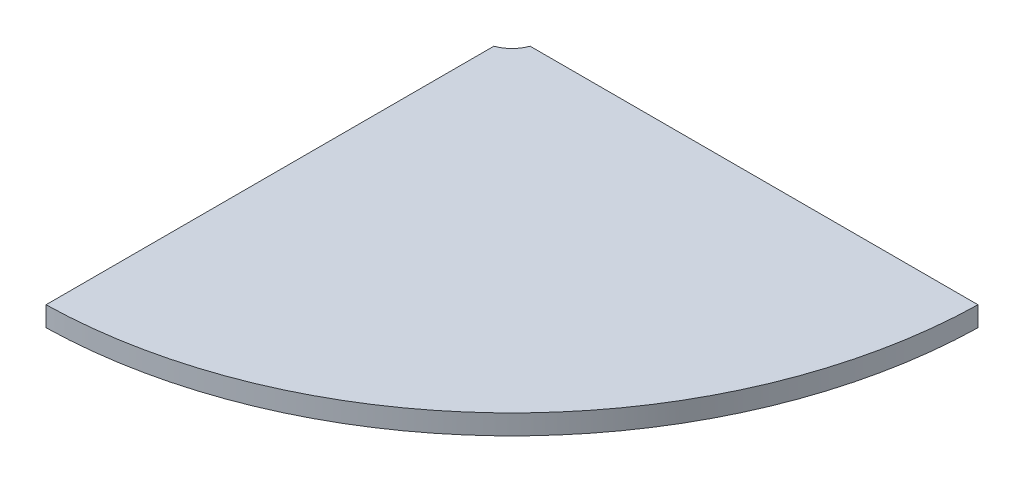
ISO-10303-21;
HEADER;
FILE_DESCRIPTION(('STEP AP214'),'2;1');
FILE_NAME('part.step','',(''),(''),'','','');
FILE_SCHEMA(('AUTOMOTIVE_DESIGN { 1 0 10303 214 1 1 1 1 }'));
ENDSEC;
DATA;
#1=APPLICATION_CONTEXT('core data for automotive mechanical design processes');
#2=APPLICATION_PROTOCOL_DEFINITION('international standard','automotive_design',2000,#1);
#3=PRODUCT_CONTEXT('',#1,'mechanical');
#4=PRODUCT('Part','Part','',(#3));
#5=PRODUCT_RELATED_PRODUCT_CATEGORY('part','',(#4));
#6=PRODUCT_DEFINITION_FORMATION('','',#4);
#7=PRODUCT_DEFINITION_CONTEXT('part definition',#1,'design');
#8=PRODUCT_DEFINITION('design','',#6,#7);
#9=PRODUCT_DEFINITION_SHAPE('','',#8);
#10=(LENGTH_UNIT() NAMED_UNIT(*) SI_UNIT(.MILLI.,.METRE.));
#11=(NAMED_UNIT(*) PLANE_ANGLE_UNIT() SI_UNIT($,.RADIAN.));
#12=(NAMED_UNIT(*) SI_UNIT($,.STERADIAN.) SOLID_ANGLE_UNIT());
#13=UNCERTAINTY_MEASURE_WITH_UNIT(LENGTH_MEASURE(1.E-05),#10,'distance_accuracy_value','');
#14=(GEOMETRIC_REPRESENTATION_CONTEXT(3) GLOBAL_UNCERTAINTY_ASSIGNED_CONTEXT((#13)) GLOBAL_UNIT_ASSIGNED_CONTEXT((#10,
#11,#12)) REPRESENTATION_CONTEXT('',''));
#15=CARTESIAN_POINT('',(0.,0.,0.));
#16=DIRECTION('',(0.,0.,1.));
#17=DIRECTION('',(1.,0.,0.));
#18=AXIS2_PLACEMENT_3D('',#15,#16,#17);
#19=CARTESIAN_POINT('',(-0.0717741825261257,10.,-0.104655935948575));
#20=DIRECTION('',(0.,-1.,0.));
#21=DIRECTION('',(0.,0.,-1.));
#22=AXIS2_PLACEMENT_3D('',#19,#20,#21);
#23=CYLINDRICAL_SURFACE('',#22,239.031706039067);
#24=CARTESIAN_POINT('',(-0.0717741825261257,0.,-0.104655935948575));
#25=DIRECTION('',(0.,1.,0.));
#26=DIRECTION('',(0.,0.,1.));
#27=AXIS2_PLACEMENT_3D('',#24,#25,#26);
#28=CIRCLE('',#27,239.031706039067);
#29=CARTESIAN_POINT('',(4.90805302662105,0.,238.875171273199));
#30=VERTEX_POINT('',#29);
#31=CARTESIAN_POINT('',(238.908053026621,0.,4.87517127319865));
#32=VERTEX_POINT('',#31);
#33=EDGE_CURVE('E113',#30,#32,#28,.T.);
#34=ORIENTED_EDGE('',*,*,#33,.T.);
#35=DIRECTION('',(0.,-1.,0.));
#36=VECTOR('',#35,1.);
#37=CARTESIAN_POINT('',(238.908053026621,10.,4.87517127319865));
#38=LINE('',#37,#36);
#39=CARTESIAN_POINT('',(238.908053026621,10.,4.87517127319865));
#40=VERTEX_POINT('',#39);
#41=EDGE_CURVE('E11',#40,#32,#38,.T.);
#42=ORIENTED_EDGE('',*,*,#41,.F.);
#43=CARTESIAN_POINT('',(-0.0717741825261257,10.,-0.104655935948575));
#44=DIRECTION('',(0.,1.,0.));
#45=DIRECTION('',(0.,0.,1.));
#46=AXIS2_PLACEMENT_3D('',#43,#44,#45);
#47=CIRCLE('',#46,239.031706039067);
#48=CARTESIAN_POINT('',(4.90805302662105,10.,238.875171273199));
#49=VERTEX_POINT('',#48);
#50=EDGE_CURVE('E97',#49,#40,#47,.T.);
#51=ORIENTED_EDGE('',*,*,#50,.F.);
#52=DIRECTION('',(0.,-1.,0.));
#53=VECTOR('',#52,1.);
#54=CARTESIAN_POINT('',(4.90805302662105,10.,238.875171273199));
#55=LINE('',#54,#53);
#56=EDGE_CURVE('E109',#49,#30,#55,.T.);
#57=ORIENTED_EDGE('',*,*,#56,.T.);
#58=EDGE_LOOP('',(#34,#42,#51,#57));
#59=FACE_BOUND('',#58,.T.);
#60=ADVANCED_FACE('F45',(#59),#23,.T.);
#61=CARTESIAN_POINT('',(238.908053026621,10.,4.87517127319865));
#62=DIRECTION('',(0.,0.,1.));
#63=DIRECTION('',(1.,0.,0.));
#64=AXIS2_PLACEMENT_3D('',#61,#62,#63);
#65=PLANE('',#64);
#66=DIRECTION('',(-1.,0.,0.));
#67=VECTOR('',#66,1.);
#68=CARTESIAN_POINT('',(238.908053026621,0.,4.87517127319865));
#69=LINE('',#68,#67);
#70=CARTESIAN_POINT('',(14.013304172375,0.,4.87517127319865));
#71=VERTEX_POINT('',#70);
#72=EDGE_CURVE('E102',#32,#71,#69,.T.);
#73=ORIENTED_EDGE('',*,*,#72,.T.);
#74=DIRECTION('',(0.,-1.,0.));
#75=VECTOR('',#74,1.);
#76=CARTESIAN_POINT('',(14.013304172375,10.,4.87517127319865));
#77=LINE('',#76,#75);
#78=CARTESIAN_POINT('',(14.013304172375,10.,4.87517127319865));
#79=VERTEX_POINT('',#78);
#80=EDGE_CURVE('E54',#79,#71,#77,.T.);
#81=ORIENTED_EDGE('',*,*,#80,.F.);
#82=DIRECTION('',(-1.,0.,0.));
#83=VECTOR('',#82,1.);
#84=CARTESIAN_POINT('',(238.908053026621,10.,4.87517127319865));
#85=LINE('',#84,#83);
#86=EDGE_CURVE('E92',#40,#79,#85,.T.);
#87=ORIENTED_EDGE('',*,*,#86,.F.);
#88=ORIENTED_EDGE('',*,*,#41,.T.);
#89=EDGE_LOOP('',(#73,#81,#87,#88));
#90=FACE_BOUND('',#89,.T.);
#91=ADVANCED_FACE('F101',(#90),#65,.F.);
#92=CARTESIAN_POINT('',(-0.0717741825261257,10.,-0.104655935948576));
#93=DIRECTION('',(0.,-1.,0.));
#94=DIRECTION('',(0.,0.,-1.));
#95=AXIS2_PLACEMENT_3D('',#92,#93,#94);
#96=CYLINDRICAL_SURFACE('',#95,14.9394816274417);
#97=CARTESIAN_POINT('',(-0.0717741825261257,0.,-0.104655935948576));
#98=DIRECTION('',(0.,-1.,0.));
#99=DIRECTION('',(0.,0.,1.));
#100=AXIS2_PLACEMENT_3D('',#97,#98,#99);
#101=CIRCLE('',#100,14.9394816274417);
#102=CARTESIAN_POINT('',(4.90805302662105,0.,13.9804224189526));
#103=VERTEX_POINT('',#102);
#104=EDGE_CURVE('E79',#71,#103,#101,.T.);
#105=ORIENTED_EDGE('',*,*,#104,.T.);
#106=DIRECTION('',(0.,-1.,0.));
#107=VECTOR('',#106,1.);
#108=CARTESIAN_POINT('',(4.90805302662105,10.,13.9804224189526));
#109=LINE('',#108,#107);
#110=CARTESIAN_POINT('',(4.90805302662105,10.,13.9804224189526));
#111=VERTEX_POINT('',#110);
#112=EDGE_CURVE('E104',#111,#103,#109,.T.);
#113=ORIENTED_EDGE('',*,*,#112,.F.);
#114=CARTESIAN_POINT('',(-0.0717741825261257,10.,-0.104655935948576));
#115=DIRECTION('',(0.,-1.,0.));
#116=DIRECTION('',(0.,0.,1.));
#117=AXIS2_PLACEMENT_3D('',#114,#115,#116);
#118=CIRCLE('',#117,14.9394816274417);
#119=EDGE_CURVE('E95',#79,#111,#118,.T.);
#120=ORIENTED_EDGE('',*,*,#119,.F.);
#121=ORIENTED_EDGE('',*,*,#80,.T.);
#122=EDGE_LOOP('',(#105,#113,#120,#121));
#123=FACE_BOUND('',#122,.T.);
#124=ADVANCED_FACE('F105',(#123),#96,.F.);
#125=CARTESIAN_POINT('',(4.90805302662105,10.,13.9804224189526));
#126=DIRECTION('',(1.,0.,0.));
#127=DIRECTION('',(0.,0.,-1.));
#128=AXIS2_PLACEMENT_3D('',#125,#126,#127);
#129=PLANE('',#128);
#130=DIRECTION('',(0.,0.,1.));
#131=VECTOR('',#130,1.);
#132=CARTESIAN_POINT('',(4.90805302662105,0.,13.9804224189526));
#133=LINE('',#132,#131);
#134=EDGE_CURVE('E85',#103,#30,#133,.T.);
#135=ORIENTED_EDGE('',*,*,#134,.T.);
#136=ORIENTED_EDGE('',*,*,#56,.F.);
#137=DIRECTION('',(0.,0.,1.));
#138=VECTOR('',#137,1.);
#139=CARTESIAN_POINT('',(4.90805302662105,10.,13.9804224189526));
#140=LINE('',#139,#138);
#141=EDGE_CURVE('E62',#111,#49,#140,.T.);
#142=ORIENTED_EDGE('',*,*,#141,.F.);
#143=ORIENTED_EDGE('',*,*,#112,.T.);
#144=EDGE_LOOP('',(#135,#136,#142,#143));
#145=FACE_BOUND('',#144,.T.);
#146=ADVANCED_FACE('F126',(#145),#129,.F.);
#147=CARTESIAN_POINT('',(-0.0717741825261257,10.,-0.104655935948575));
#148=DIRECTION('',(0.,1.,0.));
#149=DIRECTION('',(0.,0.,1.));
#150=AXIS2_PLACEMENT_3D('',#147,#148,#149);
#151=PLANE('',#150);
#152=ORIENTED_EDGE('',*,*,#50,.T.);
#153=ORIENTED_EDGE('',*,*,#86,.T.);
#154=ORIENTED_EDGE('',*,*,#119,.T.);
#155=ORIENTED_EDGE('',*,*,#141,.T.);
#156=EDGE_LOOP('',(#152,#153,#154,#155));
#157=FACE_BOUND('',#156,.T.);
#158=ADVANCED_FACE('F93',(#157),#151,.T.);
#159=CARTESIAN_POINT('',(-0.0717741825261257,0.,-0.104655935948575));
#160=DIRECTION('',(0.,1.,0.));
#161=DIRECTION('',(0.,0.,1.));
#162=AXIS2_PLACEMENT_3D('',#159,#160,#161);
#163=PLANE('',#162);
#164=ORIENTED_EDGE('',*,*,#33,.F.);
#165=ORIENTED_EDGE('',*,*,#134,.F.);
#166=ORIENTED_EDGE('',*,*,#104,.F.);
#167=ORIENTED_EDGE('',*,*,#72,.F.);
#168=EDGE_LOOP('',(#164,#165,#166,#167));
#169=FACE_BOUND('',#168,.T.);
#170=ADVANCED_FACE('F129',(#169),#163,.F.);
#171=CLOSED_SHELL('',(#60,#91,#124,#146,#158,#170));
#172=MANIFOLD_SOLID_BREP('B2',#171);
#173=ADVANCED_BREP_SHAPE_REPRESENTATION('',(#18,#172),#14);
#174=SHAPE_DEFINITION_REPRESENTATION(#9,#173);
ENDSEC;
END-ISO-10303-21;
